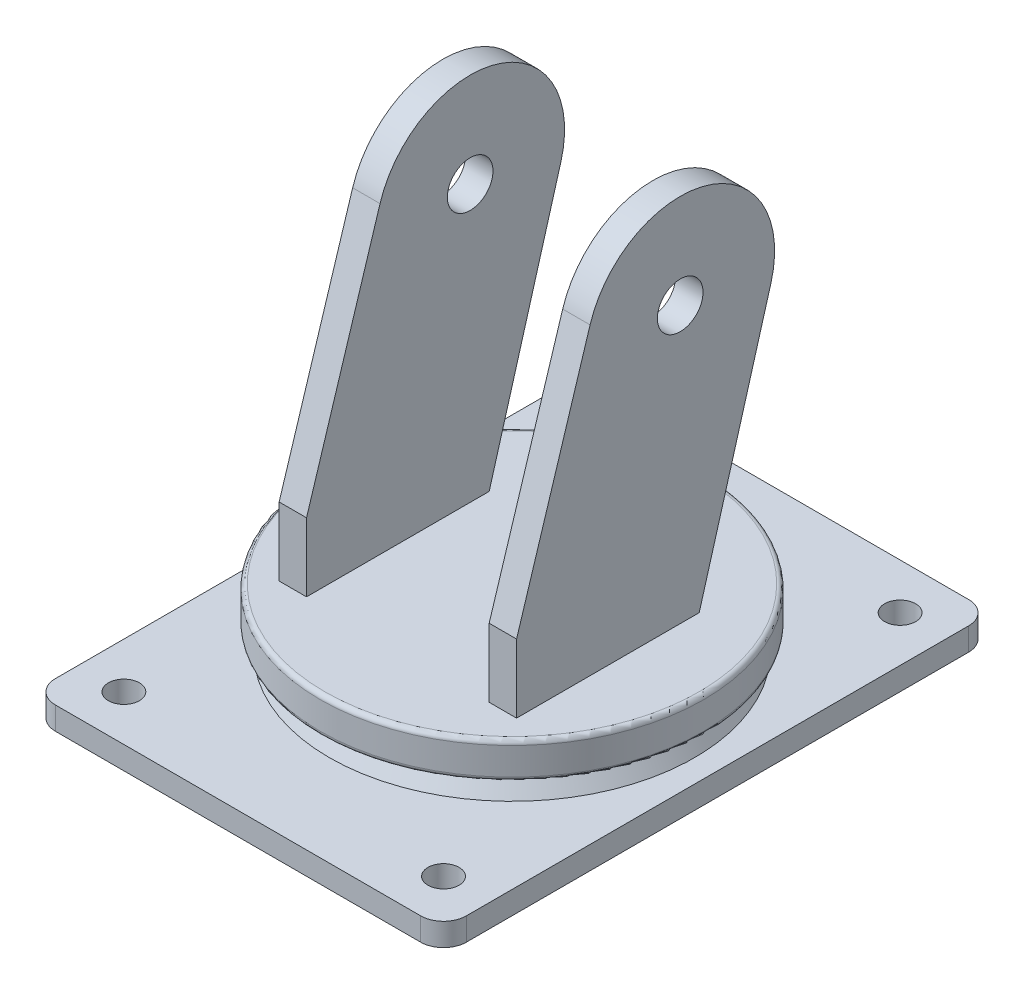
ISO-10303-21;
HEADER;
FILE_DESCRIPTION(('STEP AP214'),'2;1');
FILE_NAME('part.step','',(''),(''),'','','');
FILE_SCHEMA(('AUTOMOTIVE_DESIGN { 1 0 10303 214 1 1 1 1 }'));
ENDSEC;
DATA;
#1=APPLICATION_CONTEXT('core data for automotive mechanical design processes');
#2=APPLICATION_PROTOCOL_DEFINITION('international standard','automotive_design',2000,#1);
#3=PRODUCT_CONTEXT('',#1,'mechanical');
#4=PRODUCT('Part','Part','',(#3));
#5=PRODUCT_RELATED_PRODUCT_CATEGORY('part','',(#4));
#6=PRODUCT_DEFINITION_FORMATION('','',#4);
#7=PRODUCT_DEFINITION_CONTEXT('part definition',#1,'design');
#8=PRODUCT_DEFINITION('design','',#6,#7);
#9=PRODUCT_DEFINITION_SHAPE('','',#8);
#10=(LENGTH_UNIT() NAMED_UNIT(*) SI_UNIT(.MILLI.,.METRE.));
#11=(NAMED_UNIT(*) PLANE_ANGLE_UNIT() SI_UNIT($,.RADIAN.));
#12=(NAMED_UNIT(*) SI_UNIT($,.STERADIAN.) SOLID_ANGLE_UNIT());
#13=UNCERTAINTY_MEASURE_WITH_UNIT(LENGTH_MEASURE(1.E-05),#10,'distance_accuracy_value','');
#14=(GEOMETRIC_REPRESENTATION_CONTEXT(3) GLOBAL_UNCERTAINTY_ASSIGNED_CONTEXT((#13)) GLOBAL_UNIT_ASSIGNED_CONTEXT((#10,
#11,#12)) REPRESENTATION_CONTEXT('',''));
#15=CARTESIAN_POINT('',(0.,0.,0.));
#16=DIRECTION('',(0.,0.,1.));
#17=DIRECTION('',(1.,0.,0.));
#18=AXIS2_PLACEMENT_3D('',#15,#16,#17);
#19=CARTESIAN_POINT('',(45.,5.,-60.));
#20=DIRECTION('',(-1.,0.,0.));
#21=DIRECTION('',(0.,0.,1.));
#22=AXIS2_PLACEMENT_3D('',#19,#20,#21);
#23=PLANE('',#22);
#24=DIRECTION('',(0.,0.,-1.));
#25=VECTOR('',#24,1.);
#26=CARTESIAN_POINT('',(45.,5.,-60.));
#27=LINE('',#26,#25);
#28=CARTESIAN_POINT('',(45.,5.,55.));
#29=VERTEX_POINT('',#28);
#30=CARTESIAN_POINT('',(45.,5.,-55.));
#31=VERTEX_POINT('',#30);
#32=EDGE_CURVE('E265',#29,#31,#27,.T.);
#33=ORIENTED_EDGE('',*,*,#32,.F.);
#34=DIRECTION('',(0.,-1.,0.));
#35=VECTOR('',#34,1.);
#36=CARTESIAN_POINT('',(45.,5.,55.));
#37=LINE('',#36,#35);
#38=CARTESIAN_POINT('',(45.,0.,55.));
#39=VERTEX_POINT('',#38);
#40=EDGE_CURVE('E291',#29,#39,#37,.T.);
#41=ORIENTED_EDGE('',*,*,#40,.T.);
#42=DIRECTION('',(0.,0.,-1.));
#43=VECTOR('',#42,1.);
#44=CARTESIAN_POINT('',(45.,0.,-60.));
#45=LINE('',#44,#43);
#46=CARTESIAN_POINT('',(45.,0.,-55.));
#47=VERTEX_POINT('',#46);
#48=EDGE_CURVE('E279',#39,#47,#45,.T.);
#49=ORIENTED_EDGE('',*,*,#48,.T.);
#50=DIRECTION('',(0.,-1.,0.));
#51=VECTOR('',#50,1.);
#52=CARTESIAN_POINT('',(45.,5.,-55.));
#53=LINE('',#52,#51);
#54=EDGE_CURVE('E278',#47,#31,#53,.F.);
#55=ORIENTED_EDGE('',*,*,#54,.T.);
#56=EDGE_LOOP('',(#33,#41,#49,#55));
#57=FACE_BOUND('',#56,.T.);
#58=ADVANCED_FACE('F47',(#57),#23,.F.);
#59=CARTESIAN_POINT('',(-45.,5.,-60.));
#60=DIRECTION('',(0.,0.,1.));
#61=DIRECTION('',(1.,0.,0.));
#62=AXIS2_PLACEMENT_3D('',#59,#60,#61);
#63=PLANE('',#62);
#64=DIRECTION('',(-1.,0.,0.));
#65=VECTOR('',#64,1.);
#66=CARTESIAN_POINT('',(-45.,0.,-60.));
#67=LINE('',#66,#65);
#68=CARTESIAN_POINT('',(39.9999999999999,0.,-60.));
#69=VERTEX_POINT('',#68);
#70=CARTESIAN_POINT('',(-40.,0.,-60.));
#71=VERTEX_POINT('',#70);
#72=EDGE_CURVE('E282',#69,#71,#67,.T.);
#73=ORIENTED_EDGE('',*,*,#72,.T.);
#74=DIRECTION('',(0.,-1.,0.));
#75=VECTOR('',#74,1.);
#76=CARTESIAN_POINT('',(-40.,5.,-60.));
#77=LINE('',#76,#75);
#78=CARTESIAN_POINT('',(-40.,5.,-60.));
#79=VERTEX_POINT('',#78);
#80=EDGE_CURVE('E323',#71,#79,#77,.F.);
#81=ORIENTED_EDGE('',*,*,#80,.T.);
#82=DIRECTION('',(-1.,0.,0.));
#83=VECTOR('',#82,1.);
#84=CARTESIAN_POINT('',(-45.,5.,-60.));
#85=LINE('',#84,#83);
#86=CARTESIAN_POINT('',(39.9999999999999,5.,-60.));
#87=VERTEX_POINT('',#86);
#88=EDGE_CURVE('E268',#87,#79,#85,.T.);
#89=ORIENTED_EDGE('',*,*,#88,.F.);
#90=DIRECTION('',(0.,-1.,0.));
#91=VECTOR('',#90,1.);
#92=CARTESIAN_POINT('',(40.,5.,-60.));
#93=LINE('',#92,#91);
#94=EDGE_CURVE('E320',#87,#69,#93,.T.);
#95=ORIENTED_EDGE('',*,*,#94,.T.);
#96=EDGE_LOOP('',(#73,#81,#89,#95));
#97=FACE_BOUND('',#96,.T.);
#98=ADVANCED_FACE('F370',(#97),#63,.F.);
#99=CARTESIAN_POINT('',(-45.,5.,-60.));
#100=DIRECTION('',(1.,0.,0.));
#101=DIRECTION('',(0.,0.,-1.));
#102=AXIS2_PLACEMENT_3D('',#99,#100,#101);
#103=PLANE('',#102);
#104=DIRECTION('',(0.,0.,1.));
#105=VECTOR('',#104,1.);
#106=CARTESIAN_POINT('',(-45.,0.,-60.));
#107=LINE('',#106,#105);
#108=CARTESIAN_POINT('',(-45.,0.,-55.));
#109=VERTEX_POINT('',#108);
#110=CARTESIAN_POINT('',(-45.,0.,55.));
#111=VERTEX_POINT('',#110);
#112=EDGE_CURVE('E285',#109,#111,#107,.T.);
#113=ORIENTED_EDGE('',*,*,#112,.T.);
#114=DIRECTION('',(0.,-1.,0.));
#115=VECTOR('',#114,1.);
#116=CARTESIAN_POINT('',(-45.,5.,55.));
#117=LINE('',#116,#115);
#118=CARTESIAN_POINT('',(-45.,5.,55.));
#119=VERTEX_POINT('',#118);
#120=EDGE_CURVE('E318',#111,#119,#117,.F.);
#121=ORIENTED_EDGE('',*,*,#120,.T.);
#122=DIRECTION('',(0.,0.,1.));
#123=VECTOR('',#122,1.);
#124=CARTESIAN_POINT('',(-45.,5.,-60.));
#125=LINE('',#124,#123);
#126=CARTESIAN_POINT('',(-45.,5.,-55.));
#127=VERTEX_POINT('',#126);
#128=EDGE_CURVE('E272',#127,#119,#125,.T.);
#129=ORIENTED_EDGE('',*,*,#128,.F.);
#130=DIRECTION('',(0.,-1.,0.));
#131=VECTOR('',#130,1.);
#132=CARTESIAN_POINT('',(-45.,5.,-55.));
#133=LINE('',#132,#131);
#134=EDGE_CURVE('E315',#127,#109,#133,.T.);
#135=ORIENTED_EDGE('',*,*,#134,.T.);
#136=EDGE_LOOP('',(#113,#121,#129,#135));
#137=FACE_BOUND('',#136,.T.);
#138=ADVANCED_FACE('F376',(#137),#103,.F.);
#139=CARTESIAN_POINT('',(-45.,5.,60.));
#140=DIRECTION('',(0.,0.,-1.));
#141=DIRECTION('',(-1.,0.,0.));
#142=AXIS2_PLACEMENT_3D('',#139,#140,#141);
#143=PLANE('',#142);
#144=DIRECTION('',(1.,0.,0.));
#145=VECTOR('',#144,1.);
#146=CARTESIAN_POINT('',(-45.,0.,60.));
#147=LINE('',#146,#145);
#148=CARTESIAN_POINT('',(-40.,0.,60.));
#149=VERTEX_POINT('',#148);
#150=CARTESIAN_POINT('',(40.,0.,60.));
#151=VERTEX_POINT('',#150);
#152=EDGE_CURVE('E269',#149,#151,#147,.T.);
#153=ORIENTED_EDGE('',*,*,#152,.T.);
#154=DIRECTION('',(0.,-1.,0.));
#155=VECTOR('',#154,1.);
#156=CARTESIAN_POINT('',(40.,5.,60.));
#157=LINE('',#156,#155);
#158=CARTESIAN_POINT('',(40.,5.,60.));
#159=VERTEX_POINT('',#158);
#160=EDGE_CURVE('E305',#151,#159,#157,.F.);
#161=ORIENTED_EDGE('',*,*,#160,.T.);
#162=DIRECTION('',(1.,0.,0.));
#163=VECTOR('',#162,1.);
#164=CARTESIAN_POINT('',(-45.,5.,60.));
#165=LINE('',#164,#163);
#166=CARTESIAN_POINT('',(-40.,5.,60.));
#167=VERTEX_POINT('',#166);
#168=EDGE_CURVE('E275',#167,#159,#165,.T.);
#169=ORIENTED_EDGE('',*,*,#168,.F.);
#170=DIRECTION('',(0.,-1.,0.));
#171=VECTOR('',#170,1.);
#172=CARTESIAN_POINT('',(-40.,5.,60.));
#173=LINE('',#172,#171);
#174=EDGE_CURVE('E302',#167,#149,#173,.T.);
#175=ORIENTED_EDGE('',*,*,#174,.T.);
#176=EDGE_LOOP('',(#153,#161,#169,#175));
#177=FACE_BOUND('',#176,.T.);
#178=ADVANCED_FACE('F460',(#177),#143,.F.);
#179=CARTESIAN_POINT('',(0.,5.,0.));
#180=DIRECTION('',(0.,1.,0.));
#181=DIRECTION('',(0.,0.,1.));
#182=AXIS2_PLACEMENT_3D('',#179,#180,#181);
#183=PLANE('',#182);
#184=CARTESIAN_POINT('',(0.,5.,0.));
#185=DIRECTION('',(0.,1.,0.));
#186=DIRECTION('',(0.,0.,1.));
#187=AXIS2_PLACEMENT_3D('',#184,#185,#186);
#188=CIRCLE('',#187,40.);
#189=CARTESIAN_POINT('',(0.,4.99999999999999,40.));
#190=VERTEX_POINT('',#189);
#191=EDGE_CURVE('E242',#190,#190,#188,.T.);
#192=ORIENTED_EDGE('',*,*,#191,.F.);
#193=EDGE_LOOP('',(#192));
#194=FACE_BOUND('',#193,.T.);
#195=CARTESIAN_POINT('',(35.,5.,50.));
#196=DIRECTION('',(0.,1.,0.));
#197=DIRECTION('',(0.,0.,1.));
#198=AXIS2_PLACEMENT_3D('',#195,#196,#197);
#199=CIRCLE('',#198,3.4);
#200=CARTESIAN_POINT('',(35.,5.,53.4));
#201=VERTEX_POINT('',#200);
#202=EDGE_CURVE('E249',#201,#201,#199,.T.);
#203=ORIENTED_EDGE('',*,*,#202,.F.);
#204=EDGE_LOOP('',(#203));
#205=FACE_BOUND('',#204,.T.);
#206=CARTESIAN_POINT('',(-35.,5.,50.));
#207=DIRECTION('',(0.,1.,0.));
#208=DIRECTION('',(0.,0.,1.));
#209=AXIS2_PLACEMENT_3D('',#206,#207,#208);
#210=CIRCLE('',#209,3.4);
#211=CARTESIAN_POINT('',(-35.,5.,53.4));
#212=VERTEX_POINT('',#211);
#213=EDGE_CURVE('E253',#212,#212,#210,.T.);
#214=ORIENTED_EDGE('',*,*,#213,.F.);
#215=EDGE_LOOP('',(#214));
#216=FACE_BOUND('',#215,.T.);
#217=CARTESIAN_POINT('',(35.,5.,-50.));
#218=DIRECTION('',(0.,1.,0.));
#219=DIRECTION('',(0.,0.,1.));
#220=AXIS2_PLACEMENT_3D('',#217,#218,#219);
#221=CIRCLE('',#220,3.4);
#222=CARTESIAN_POINT('',(35.,5.,-46.6));
#223=VERTEX_POINT('',#222);
#224=EDGE_CURVE('E257',#223,#223,#221,.T.);
#225=ORIENTED_EDGE('',*,*,#224,.F.);
#226=EDGE_LOOP('',(#225));
#227=FACE_BOUND('',#226,.T.);
#228=CARTESIAN_POINT('',(-35.,5.,-50.));
#229=DIRECTION('',(0.,1.,0.));
#230=DIRECTION('',(0.,0.,1.));
#231=AXIS2_PLACEMENT_3D('',#228,#229,#230);
#232=CIRCLE('',#231,3.4);
#233=CARTESIAN_POINT('',(-35.,5.,-46.6));
#234=VERTEX_POINT('',#233);
#235=EDGE_CURVE('E261',#234,#234,#232,.T.);
#236=ORIENTED_EDGE('',*,*,#235,.F.);
#237=EDGE_LOOP('',(#236));
#238=FACE_BOUND('',#237,.T.);
#239=ORIENTED_EDGE('',*,*,#168,.T.);
#240=CARTESIAN_POINT('',(40.,5.,55.));
#241=DIRECTION('',(0.,1.,0.));
#242=DIRECTION('',(0.,0.,1.));
#243=AXIS2_PLACEMENT_3D('',#240,#241,#242);
#244=CIRCLE('',#243,5.);
#245=EDGE_CURVE('E313',#159,#29,#244,.T.);
#246=ORIENTED_EDGE('',*,*,#245,.T.);
#247=ORIENTED_EDGE('',*,*,#32,.T.);
#248=CARTESIAN_POINT('',(40.,5.,-55.));
#249=DIRECTION('',(0.,1.,0.));
#250=DIRECTION('',(0.,0.,1.));
#251=AXIS2_PLACEMENT_3D('',#248,#249,#250);
#252=CIRCLE('',#251,5.);
#253=EDGE_CURVE('E307',#31,#87,#252,.T.);
#254=ORIENTED_EDGE('',*,*,#253,.T.);
#255=ORIENTED_EDGE('',*,*,#88,.T.);
#256=CARTESIAN_POINT('',(-40.,5.,-55.));
#257=DIRECTION('',(0.,1.,0.));
#258=DIRECTION('',(0.,0.,1.));
#259=AXIS2_PLACEMENT_3D('',#256,#257,#258);
#260=CIRCLE('',#259,5.);
#261=EDGE_CURVE('E309',#79,#127,#260,.T.);
#262=ORIENTED_EDGE('',*,*,#261,.T.);
#263=ORIENTED_EDGE('',*,*,#128,.T.);
#264=CARTESIAN_POINT('',(-40.,5.,55.));
#265=DIRECTION('',(0.,1.,0.));
#266=DIRECTION('',(0.,0.,1.));
#267=AXIS2_PLACEMENT_3D('',#264,#265,#266);
#268=CIRCLE('',#267,5.);
#269=EDGE_CURVE('E311',#119,#167,#268,.T.);
#270=ORIENTED_EDGE('',*,*,#269,.T.);
#271=EDGE_LOOP('',(#239,#246,#247,#254,#255,#262,#263,#270));
#272=FACE_BOUND('',#271,.T.);
#273=ADVANCED_FACE('F457',(#194,#205,#216,#227,#238,#272),#183,.T.);
#274=CARTESIAN_POINT('',(0.,0.,0.));
#275=DIRECTION('',(0.,1.,0.));
#276=DIRECTION('',(0.,0.,1.));
#277=AXIS2_PLACEMENT_3D('',#274,#275,#276);
#278=PLANE('',#277);
#279=CARTESIAN_POINT('',(0.,0.,0.));
#280=DIRECTION('',(0.,1.,0.));
#281=DIRECTION('',(0.,0.,1.));
#282=AXIS2_PLACEMENT_3D('',#279,#280,#281);
#283=CIRCLE('',#282,18.);
#284=CARTESIAN_POINT('',(0.,0.,18.));
#285=VERTEX_POINT('',#284);
#286=EDGE_CURVE('E336',#285,#285,#283,.T.);
#287=ORIENTED_EDGE('',*,*,#286,.T.);
#288=EDGE_LOOP('',(#287));
#289=FACE_BOUND('',#288,.T.);
#290=CARTESIAN_POINT('',(35.,0.,50.));
#291=DIRECTION('',(0.,1.,0.));
#292=DIRECTION('',(0.,0.,1.));
#293=AXIS2_PLACEMENT_3D('',#290,#291,#292);
#294=CIRCLE('',#293,3.4);
#295=CARTESIAN_POINT('',(35.,0.,53.4));
#296=VERTEX_POINT('',#295);
#297=EDGE_CURVE('E252',#296,#296,#294,.T.);
#298=ORIENTED_EDGE('',*,*,#297,.T.);
#299=EDGE_LOOP('',(#298));
#300=FACE_BOUND('',#299,.T.);
#301=CARTESIAN_POINT('',(-35.,0.,50.));
#302=DIRECTION('',(0.,1.,0.));
#303=DIRECTION('',(0.,0.,1.));
#304=AXIS2_PLACEMENT_3D('',#301,#302,#303);
#305=CIRCLE('',#304,3.4);
#306=CARTESIAN_POINT('',(-35.,0.,53.4));
#307=VERTEX_POINT('',#306);
#308=EDGE_CURVE('E256',#307,#307,#305,.T.);
#309=ORIENTED_EDGE('',*,*,#308,.T.);
#310=EDGE_LOOP('',(#309));
#311=FACE_BOUND('',#310,.T.);
#312=CARTESIAN_POINT('',(35.,0.,-50.));
#313=DIRECTION('',(0.,1.,0.));
#314=DIRECTION('',(0.,0.,1.));
#315=AXIS2_PLACEMENT_3D('',#312,#313,#314);
#316=CIRCLE('',#315,3.4);
#317=CARTESIAN_POINT('',(35.,0.,-46.6));
#318=VERTEX_POINT('',#317);
#319=EDGE_CURVE('E260',#318,#318,#316,.T.);
#320=ORIENTED_EDGE('',*,*,#319,.T.);
#321=EDGE_LOOP('',(#320));
#322=FACE_BOUND('',#321,.T.);
#323=CARTESIAN_POINT('',(-35.,0.,-50.));
#324=DIRECTION('',(0.,1.,0.));
#325=DIRECTION('',(0.,0.,1.));
#326=AXIS2_PLACEMENT_3D('',#323,#324,#325);
#327=CIRCLE('',#326,3.4);
#328=CARTESIAN_POINT('',(-35.,0.,-46.6));
#329=VERTEX_POINT('',#328);
#330=EDGE_CURVE('E264',#329,#329,#327,.T.);
#331=ORIENTED_EDGE('',*,*,#330,.T.);
#332=EDGE_LOOP('',(#331));
#333=FACE_BOUND('',#332,.T.);
#334=ORIENTED_EDGE('',*,*,#48,.F.);
#335=CARTESIAN_POINT('',(40.,0.,55.));
#336=DIRECTION('',(0.,1.,0.));
#337=DIRECTION('',(0.,0.,1.));
#338=AXIS2_PLACEMENT_3D('',#335,#336,#337);
#339=CIRCLE('',#338,5.);
#340=EDGE_CURVE('E300',#39,#151,#339,.F.);
#341=ORIENTED_EDGE('',*,*,#340,.T.);
#342=ORIENTED_EDGE('',*,*,#152,.F.);
#343=CARTESIAN_POINT('',(-40.,0.,55.));
#344=DIRECTION('',(0.,1.,0.));
#345=DIRECTION('',(0.,0.,1.));
#346=AXIS2_PLACEMENT_3D('',#343,#344,#345);
#347=CIRCLE('',#346,5.);
#348=EDGE_CURVE('E298',#149,#111,#347,.F.);
#349=ORIENTED_EDGE('',*,*,#348,.T.);
#350=ORIENTED_EDGE('',*,*,#112,.F.);
#351=CARTESIAN_POINT('',(-40.,0.,-55.));
#352=DIRECTION('',(0.,1.,0.));
#353=DIRECTION('',(0.,0.,1.));
#354=AXIS2_PLACEMENT_3D('',#351,#352,#353);
#355=CIRCLE('',#354,5.);
#356=EDGE_CURVE('E296',#109,#71,#355,.F.);
#357=ORIENTED_EDGE('',*,*,#356,.T.);
#358=ORIENTED_EDGE('',*,*,#72,.F.);
#359=CARTESIAN_POINT('',(40.,0.,-55.));
#360=DIRECTION('',(0.,1.,0.));
#361=DIRECTION('',(0.,0.,1.));
#362=AXIS2_PLACEMENT_3D('',#359,#360,#361);
#363=CIRCLE('',#362,5.);
#364=EDGE_CURVE('E294',#69,#47,#363,.F.);
#365=ORIENTED_EDGE('',*,*,#364,.T.);
#366=EDGE_LOOP('',(#334,#341,#342,#349,#350,#357,#358,#365));
#367=FACE_BOUND('',#366,.T.);
#368=ADVANCED_FACE('F386',(#289,#300,#311,#322,#333,#367),#278,.F.);
#369=CARTESIAN_POINT('',(40.,5.,55.));
#370=DIRECTION('',(0.,-1.,0.));
#371=DIRECTION('',(0.,0.,-1.));
#372=AXIS2_PLACEMENT_3D('',#369,#370,#371);
#373=CYLINDRICAL_SURFACE('',#372,5.);
#374=ORIENTED_EDGE('',*,*,#245,.F.);
#375=ORIENTED_EDGE('',*,*,#160,.F.);
#376=ORIENTED_EDGE('',*,*,#340,.F.);
#377=ORIENTED_EDGE('',*,*,#40,.F.);
#378=EDGE_LOOP('',(#374,#375,#376,#377));
#379=FACE_BOUND('',#378,.T.);
#380=ADVANCED_FACE('F382',(#379),#373,.T.);
#381=CARTESIAN_POINT('',(-40.,5.,55.));
#382=DIRECTION('',(0.,-1.,0.));
#383=DIRECTION('',(0.,0.,-1.));
#384=AXIS2_PLACEMENT_3D('',#381,#382,#383);
#385=CYLINDRICAL_SURFACE('',#384,5.);
#386=ORIENTED_EDGE('',*,*,#269,.F.);
#387=ORIENTED_EDGE('',*,*,#120,.F.);
#388=ORIENTED_EDGE('',*,*,#348,.F.);
#389=ORIENTED_EDGE('',*,*,#174,.F.);
#390=EDGE_LOOP('',(#386,#387,#388,#389));
#391=FACE_BOUND('',#390,.T.);
#392=ADVANCED_FACE('F385',(#391),#385,.T.);
#393=CARTESIAN_POINT('',(-40.,5.,-55.));
#394=DIRECTION('',(0.,-1.,0.));
#395=DIRECTION('',(0.,0.,-1.));
#396=AXIS2_PLACEMENT_3D('',#393,#394,#395);
#397=CYLINDRICAL_SURFACE('',#396,5.);
#398=ORIENTED_EDGE('',*,*,#261,.F.);
#399=ORIENTED_EDGE('',*,*,#80,.F.);
#400=ORIENTED_EDGE('',*,*,#356,.F.);
#401=ORIENTED_EDGE('',*,*,#134,.F.);
#402=EDGE_LOOP('',(#398,#399,#400,#401));
#403=FACE_BOUND('',#402,.T.);
#404=ADVANCED_FACE('F390',(#403),#397,.T.);
#405=CARTESIAN_POINT('',(40.,5.,-55.));
#406=DIRECTION('',(0.,-1.,0.));
#407=DIRECTION('',(0.,0.,-1.));
#408=AXIS2_PLACEMENT_3D('',#405,#406,#407);
#409=CYLINDRICAL_SURFACE('',#408,5.);
#410=ORIENTED_EDGE('',*,*,#253,.F.);
#411=ORIENTED_EDGE('',*,*,#54,.F.);
#412=ORIENTED_EDGE('',*,*,#364,.F.);
#413=ORIENTED_EDGE('',*,*,#94,.F.);
#414=EDGE_LOOP('',(#410,#411,#412,#413));
#415=FACE_BOUND('',#414,.T.);
#416=ADVANCED_FACE('F394',(#415),#409,.T.);
#417=CARTESIAN_POINT('',(-35.,5.,-50.));
#418=DIRECTION('',(0.,1.,0.));
#419=DIRECTION('',(0.,0.,1.));
#420=AXIS2_PLACEMENT_3D('',#417,#418,#419);
#421=CYLINDRICAL_SURFACE('',#420,3.4);
#422=ORIENTED_EDGE('',*,*,#235,.T.);
#423=EDGE_LOOP('',(#422));
#424=FACE_BOUND('',#423,.T.);
#425=ORIENTED_EDGE('',*,*,#330,.F.);
#426=EDGE_LOOP('',(#425));
#427=FACE_BOUND('',#426,.T.);
#428=ADVANCED_FACE('F398',(#424,#427),#421,.F.);
#429=CARTESIAN_POINT('',(35.,5.,-50.));
#430=DIRECTION('',(0.,1.,0.));
#431=DIRECTION('',(0.,0.,1.));
#432=AXIS2_PLACEMENT_3D('',#429,#430,#431);
#433=CYLINDRICAL_SURFACE('',#432,3.4);
#434=ORIENTED_EDGE('',*,*,#224,.T.);
#435=EDGE_LOOP('',(#434));
#436=FACE_BOUND('',#435,.T.);
#437=ORIENTED_EDGE('',*,*,#319,.F.);
#438=EDGE_LOOP('',(#437));
#439=FACE_BOUND('',#438,.T.);
#440=ADVANCED_FACE('F449',(#436,#439),#433,.F.);
#441=CARTESIAN_POINT('',(-35.,5.,50.));
#442=DIRECTION('',(0.,1.,0.));
#443=DIRECTION('',(0.,0.,1.));
#444=AXIS2_PLACEMENT_3D('',#441,#442,#443);
#445=CYLINDRICAL_SURFACE('',#444,3.4);
#446=ORIENTED_EDGE('',*,*,#213,.T.);
#447=EDGE_LOOP('',(#446));
#448=FACE_BOUND('',#447,.T.);
#449=ORIENTED_EDGE('',*,*,#308,.F.);
#450=EDGE_LOOP('',(#449));
#451=FACE_BOUND('',#450,.T.);
#452=ADVANCED_FACE('F445',(#448,#451),#445,.F.);
#453=CARTESIAN_POINT('',(35.,5.,50.));
#454=DIRECTION('',(0.,1.,0.));
#455=DIRECTION('',(0.,0.,1.));
#456=AXIS2_PLACEMENT_3D('',#453,#454,#455);
#457=CYLINDRICAL_SURFACE('',#456,3.4);
#458=ORIENTED_EDGE('',*,*,#202,.T.);
#459=EDGE_LOOP('',(#458));
#460=FACE_BOUND('',#459,.T.);
#461=ORIENTED_EDGE('',*,*,#297,.F.);
#462=EDGE_LOOP('',(#461));
#463=FACE_BOUND('',#462,.T.);
#464=ADVANCED_FACE('F441',(#460,#463),#457,.F.);
#465=CARTESIAN_POINT('',(0.,2.,0.));
#466=DIRECTION('',(0.,-1.,0.));
#467=DIRECTION('',(0.,0.,-1.));
#468=AXIS2_PLACEMENT_3D('',#465,#466,#467);
#469=CYLINDRICAL_SURFACE('',#468,17.5);
#470=CARTESIAN_POINT('',(0.,1.5,0.));
#471=DIRECTION('',(0.,-1.,0.));
#472=DIRECTION('',(0.,0.,-1.));
#473=AXIS2_PLACEMENT_3D('',#470,#471,#472);
#474=CIRCLE('',#473,17.5);
#475=CARTESIAN_POINT('',(0.,1.5,-17.5));
#476=VERTEX_POINT('',#475);
#477=EDGE_CURVE('E246',#476,#476,#474,.F.);
#478=ORIENTED_EDGE('',*,*,#477,.T.);
#479=EDGE_LOOP('',(#478));
#480=FACE_BOUND('',#479,.T.);
#481=CARTESIAN_POINT('',(0.,0.5,0.));
#482=DIRECTION('',(0.,1.,0.));
#483=DIRECTION('',(0.,0.,1.));
#484=AXIS2_PLACEMENT_3D('',#481,#482,#483);
#485=CIRCLE('',#484,17.5);
#486=CARTESIAN_POINT('',(0.,0.5,17.5));
#487=VERTEX_POINT('',#486);
#488=EDGE_CURVE('E325',#487,#487,#485,.F.);
#489=ORIENTED_EDGE('',*,*,#488,.T.);
#490=EDGE_LOOP('',(#489));
#491=FACE_BOUND('',#490,.T.);
#492=ADVANCED_FACE('F427',(#480,#491),#469,.F.);
#493=CARTESIAN_POINT('',(0.,2.,0.));
#494=DIRECTION('',(0.,-1.,0.));
#495=DIRECTION('',(0.,0.,-1.));
#496=AXIS2_PLACEMENT_3D('',#493,#494,#495);
#497=PLANE('',#496);
#498=CARTESIAN_POINT('',(0.,2.,0.));
#499=DIRECTION('',(0.,-1.,0.));
#500=DIRECTION('',(0.,0.,-1.));
#501=AXIS2_PLACEMENT_3D('',#498,#499,#500);
#502=CIRCLE('',#501,17.);
#503=CARTESIAN_POINT('',(0.,2.,-17.));
#504=VERTEX_POINT('',#503);
#505=EDGE_CURVE('E342',#504,#504,#502,.T.);
#506=ORIENTED_EDGE('',*,*,#505,.T.);
#507=EDGE_LOOP('',(#506));
#508=FACE_BOUND('',#507,.T.);
#509=CARTESIAN_POINT('',(0.,2.,0.));
#510=DIRECTION('',(0.,-1.,0.));
#511=DIRECTION('',(0.,0.,-1.));
#512=AXIS2_PLACEMENT_3D('',#509,#510,#511);
#513=CIRCLE('',#512,16.5);
#514=CARTESIAN_POINT('',(0.,2.,-16.5));
#515=VERTEX_POINT('',#514);
#516=EDGE_CURVE('E241',#515,#515,#513,.T.);
#517=ORIENTED_EDGE('',*,*,#516,.F.);
#518=EDGE_LOOP('',(#517));
#519=FACE_BOUND('',#518,.T.);
#520=ADVANCED_FACE('F404',(#508,#519),#497,.T.);
#521=CARTESIAN_POINT('',(0.,0.5,0.));
#522=DIRECTION('',(0.,1.,0.));
#523=DIRECTION('',(0.,0.,1.));
#524=AXIS2_PLACEMENT_3D('',#521,#522,#523);
#525=TOROIDAL_SURFACE('',#524,18.,0.5);
#526=ORIENTED_EDGE('',*,*,#286,.F.);
#527=EDGE_LOOP('',(#526));
#528=FACE_BOUND('',#527,.T.);
#529=ORIENTED_EDGE('',*,*,#488,.F.);
#530=EDGE_LOOP('',(#529));
#531=FACE_BOUND('',#530,.T.);
#532=ADVANCED_FACE('F400',(#528,#531),#525,.T.);
#533=CARTESIAN_POINT('',(0.,0.,0.));
#534=DIRECTION('',(0.,-1.,0.));
#535=DIRECTION('',(0.,0.,-1.));
#536=AXIS2_PLACEMENT_3D('',#533,#534,#535);
#537=PLANE('',#536);
#538=CARTESIAN_POINT('',(0.,0.,0.));
#539=DIRECTION('',(0.,-1.,0.));
#540=DIRECTION('',(0.,0.,-1.));
#541=AXIS2_PLACEMENT_3D('',#538,#539,#540);
#542=CIRCLE('',#541,14.5);
#543=CARTESIAN_POINT('',(0.,0.,-14.5));
#544=VERTEX_POINT('',#543);
#545=EDGE_CURVE('E339',#544,#544,#542,.T.);
#546=ORIENTED_EDGE('',*,*,#545,.T.);
#547=EDGE_LOOP('',(#546));
#548=FACE_BOUND('',#547,.T.);
#549=ADVANCED_FACE('F403',(#548),#537,.T.);
#550=CARTESIAN_POINT('',(0.,2.,0.));
#551=DIRECTION('',(0.,-1.,0.));
#552=DIRECTION('',(0.,0.,-1.));
#553=AXIS2_PLACEMENT_3D('',#550,#551,#552);
#554=TOROIDAL_SURFACE('',#553,14.5,2.);
#555=ORIENTED_EDGE('',*,*,#516,.T.);
#556=EDGE_LOOP('',(#555));
#557=FACE_BOUND('',#556,.T.);
#558=ORIENTED_EDGE('',*,*,#545,.F.);
#559=EDGE_LOOP('',(#558));
#560=FACE_BOUND('',#559,.T.);
#561=ADVANCED_FACE('F406',(#557,#560),#554,.T.);
#562=CARTESIAN_POINT('',(0.,1.5,0.));
#563=DIRECTION('',(0.,-1.,0.));
#564=DIRECTION('',(0.,0.,-1.));
#565=AXIS2_PLACEMENT_3D('',#562,#563,#564);
#566=TOROIDAL_SURFACE('',#565,17.,0.5);
#567=ORIENTED_EDGE('',*,*,#477,.F.);
#568=EDGE_LOOP('',(#567));
#569=FACE_BOUND('',#568,.T.);
#570=ORIENTED_EDGE('',*,*,#505,.F.);
#571=EDGE_LOOP('',(#570));
#572=FACE_BOUND('',#571,.T.);
#573=ADVANCED_FACE('F409',(#569,#572),#566,.F.);
#574=CARTESIAN_POINT('',(0.,10.,0.));
#575=DIRECTION('',(0.,-1.,0.));
#576=DIRECTION('',(0.,0.,-1.));
#577=AXIS2_PLACEMENT_3D('',#574,#575,#576);
#578=CONICAL_SURFACE('',#577,37.,0.540419500270584);
#579=ORIENTED_EDGE('',*,*,#191,.T.);
#580=EDGE_LOOP('',(#579));
#581=FACE_BOUND('',#580,.T.);
#582=CARTESIAN_POINT('',(0.,10.,0.));
#583=DIRECTION('',(0.,1.,0.));
#584=DIRECTION('',(0.,0.,1.));
#585=AXIS2_PLACEMENT_3D('',#582,#583,#584);
#586=CIRCLE('',#585,37.);
#587=CARTESIAN_POINT('',(0.,10.,37.));
#588=VERTEX_POINT('',#587);
#589=EDGE_CURVE('E238',#588,#588,#586,.T.);
#590=ORIENTED_EDGE('',*,*,#589,.F.);
#591=EDGE_LOOP('',(#590));
#592=FACE_BOUND('',#591,.T.);
#593=ADVANCED_FACE('F412',(#581,#592),#578,.T.);
#594=CARTESIAN_POINT('',(0.,18.,0.));
#595=DIRECTION('',(0.,-1.,0.));
#596=DIRECTION('',(0.,0.,-1.));
#597=AXIS2_PLACEMENT_3D('',#594,#595,#596);
#598=CYLINDRICAL_SURFACE('',#597,42.);
#599=CARTESIAN_POINT('',(0.,17.,0.));
#600=DIRECTION('',(0.,1.,0.));
#601=DIRECTION('',(0.,0.,1.));
#602=AXIS2_PLACEMENT_3D('',#599,#600,#601);
#603=CIRCLE('',#602,42.);
#604=CARTESIAN_POINT('',(0.,17.,42.));
#605=VERTEX_POINT('',#604);
#606=EDGE_CURVE('E11',#605,#605,#603,.F.);
#607=ORIENTED_EDGE('',*,*,#606,.T.);
#608=EDGE_LOOP('',(#607));
#609=FACE_BOUND('',#608,.T.);
#610=CARTESIAN_POINT('',(0.,11.,0.));
#611=DIRECTION('',(0.,1.,0.));
#612=DIRECTION('',(0.,0.,1.));
#613=AXIS2_PLACEMENT_3D('',#610,#611,#612);
#614=CIRCLE('',#613,42.);
#615=CARTESIAN_POINT('',(0.,11.,42.));
#616=VERTEX_POINT('',#615);
#617=EDGE_CURVE('E245',#616,#616,#614,.T.);
#618=ORIENTED_EDGE('',*,*,#617,.T.);
#619=EDGE_LOOP('',(#618));
#620=FACE_BOUND('',#619,.T.);
#621=ADVANCED_FACE('F419',(#609,#620),#598,.T.);
#622=CARTESIAN_POINT('',(0.,18.,0.));
#623=DIRECTION('',(0.,1.,0.));
#624=DIRECTION('',(0.,0.,1.));
#625=AXIS2_PLACEMENT_3D('',#622,#623,#624);
#626=PLANE('',#625);
#627=CARTESIAN_POINT('',(0.,18.,0.));
#628=DIRECTION('',(0.,1.,0.));
#629=DIRECTION('',(0.,0.,1.));
#630=AXIS2_PLACEMENT_3D('',#627,#628,#629);
#631=CIRCLE('',#630,41.);
#632=CARTESIAN_POINT('',(0.,18.,41.));
#633=VERTEX_POINT('',#632);
#634=EDGE_CURVE('E55',#633,#633,#631,.T.);
#635=ORIENTED_EDGE('',*,*,#634,.T.);
#636=EDGE_LOOP('',(#635));
#637=FACE_BOUND('',#636,.T.);
#638=DIRECTION('',(0.,0.,-1.));
#639=VECTOR('',#638,1.);
#640=CARTESIAN_POINT('',(-26.,18.,0.));
#641=LINE('',#640,#639);
#642=CARTESIAN_POINT('',(-26.,18.,25.));
#643=VERTEX_POINT('',#642);
#644=CARTESIAN_POINT('',(-26.,18.,-15.));
#645=VERTEX_POINT('',#644);
#646=EDGE_CURVE('E175',#643,#645,#641,.T.);
#647=ORIENTED_EDGE('',*,*,#646,.T.);
#648=DIRECTION('',(1.,0.,0.));
#649=VECTOR('',#648,1.);
#650=CARTESIAN_POINT('',(-26.,18.,-15.));
#651=LINE('',#650,#649);
#652=CARTESIAN_POINT('',(-20.,18.,-15.));
#653=VERTEX_POINT('',#652);
#654=EDGE_CURVE('E819',#645,#653,#651,.T.);
#655=ORIENTED_EDGE('',*,*,#654,.T.);
#656=DIRECTION('',(0.,0.,-1.));
#657=VECTOR('',#656,1.);
#658=CARTESIAN_POINT('',(-20.,18.,0.));
#659=LINE('',#658,#657);
#660=CARTESIAN_POINT('',(-20.,18.,25.));
#661=VERTEX_POINT('',#660);
#662=EDGE_CURVE('E187',#661,#653,#659,.T.);
#663=ORIENTED_EDGE('',*,*,#662,.F.);
#664=DIRECTION('',(1.,0.,0.));
#665=VECTOR('',#664,1.);
#666=CARTESIAN_POINT('',(-26.,18.,25.));
#667=LINE('',#666,#665);
#668=EDGE_CURVE('E191',#643,#661,#667,.T.);
#669=ORIENTED_EDGE('',*,*,#668,.F.);
#670=EDGE_LOOP('',(#647,#655,#663,#669));
#671=FACE_BOUND('',#670,.T.);
#672=DIRECTION('',(0.,0.,-1.));
#673=VECTOR('',#672,1.);
#674=CARTESIAN_POINT('',(26.,18.,0.));
#675=LINE('',#674,#673);
#676=CARTESIAN_POINT('',(26.,18.,25.));
#677=VERTEX_POINT('',#676);
#678=CARTESIAN_POINT('',(26.,18.,-15.));
#679=VERTEX_POINT('',#678);
#680=EDGE_CURVE('E206',#677,#679,#675,.T.);
#681=ORIENTED_EDGE('',*,*,#680,.F.);
#682=DIRECTION('',(-1.,0.,0.));
#683=VECTOR('',#682,1.);
#684=CARTESIAN_POINT('',(26.,18.,25.));
#685=LINE('',#684,#683);
#686=CARTESIAN_POINT('',(20.,18.,25.));
#687=VERTEX_POINT('',#686);
#688=EDGE_CURVE('E216',#677,#687,#685,.T.);
#689=ORIENTED_EDGE('',*,*,#688,.T.);
#690=DIRECTION('',(0.,0.,-1.));
#691=VECTOR('',#690,1.);
#692=CARTESIAN_POINT('',(20.,18.,0.));
#693=LINE('',#692,#691);
#694=CARTESIAN_POINT('',(20.,18.,-15.));
#695=VERTEX_POINT('',#694);
#696=EDGE_CURVE('E198',#687,#695,#693,.T.);
#697=ORIENTED_EDGE('',*,*,#696,.T.);
#698=DIRECTION('',(-1.,0.,0.));
#699=VECTOR('',#698,1.);
#700=CARTESIAN_POINT('',(26.,18.,-15.));
#701=LINE('',#700,#699);
#702=EDGE_CURVE('E236',#679,#695,#701,.T.);
#703=ORIENTED_EDGE('',*,*,#702,.F.);
#704=EDGE_LOOP('',(#681,#689,#697,#703));
#705=FACE_BOUND('',#704,.T.);
#706=ADVANCED_FACE('F196',(#637,#671,#705),#626,.T.);
#707=CARTESIAN_POINT('',(0.,10.,0.));
#708=DIRECTION('',(0.,1.,0.));
#709=DIRECTION('',(0.,0.,1.));
#710=AXIS2_PLACEMENT_3D('',#707,#708,#709);
#711=PLANE('',#710);
#712=CARTESIAN_POINT('',(0.,10.,0.));
#713=DIRECTION('',(0.,1.,0.));
#714=DIRECTION('',(0.,0.,1.));
#715=AXIS2_PLACEMENT_3D('',#712,#713,#714);
#716=CIRCLE('',#715,41.);
#717=CARTESIAN_POINT('',(0.,10.,41.));
#718=VERTEX_POINT('',#717);
#719=EDGE_CURVE('E354',#718,#718,#716,.F.);
#720=ORIENTED_EDGE('',*,*,#719,.T.);
#721=EDGE_LOOP('',(#720));
#722=FACE_BOUND('',#721,.T.);
#723=ORIENTED_EDGE('',*,*,#589,.T.);
#724=EDGE_LOOP('',(#723));
#725=FACE_BOUND('',#724,.T.);
#726=ADVANCED_FACE('F538',(#722,#725),#711,.F.);
#727=CARTESIAN_POINT('',(26.,18.,-15.));
#728=DIRECTION('',(0.,0.276265326713221,0.961081406154566));
#729=DIRECTION('',(0.,-0.961081406154566,0.276265326713221));
#730=AXIS2_PLACEMENT_3D('',#727,#728,#729);
#731=PLANE('',#730);
#732=DIRECTION('',(0.,0.961081406154565,-0.276265326713221));
#733=VECTOR('',#732,1.);
#734=CARTESIAN_POINT('',(20.,18.,-15.));
#735=LINE('',#734,#733);
#736=CARTESIAN_POINT('',(20.,72.659714104669,-30.7120756665113));
#737=VERTEX_POINT('',#736);
#738=EDGE_CURVE('E70',#695,#737,#735,.T.);
#739=ORIENTED_EDGE('',*,*,#738,.T.);
#740=DIRECTION('',(-1.,0.,0.));
#741=VECTOR('',#740,1.);
#742=CARTESIAN_POINT('',(26.,72.659714104669,-30.7120756665113));
#743=LINE('',#742,#741);
#744=CARTESIAN_POINT('',(26.,72.659714104669,-30.7120756665113));
#745=VERTEX_POINT('',#744);
#746=EDGE_CURVE('E233',#745,#737,#743,.T.);
#747=ORIENTED_EDGE('',*,*,#746,.F.);
#748=DIRECTION('',(0.,0.961081406154565,-0.276265326713221));
#749=VECTOR('',#748,1.);
#750=CARTESIAN_POINT('',(26.,18.,-15.));
#751=LINE('',#750,#749);
#752=EDGE_CURVE('E208',#679,#745,#751,.T.);
#753=ORIENTED_EDGE('',*,*,#752,.F.);
#754=ORIENTED_EDGE('',*,*,#702,.T.);
#755=EDGE_LOOP('',(#739,#747,#753,#754));
#756=FACE_BOUND('',#755,.T.);
#757=ADVANCED_FACE('F543',(#756),#731,.F.);
#758=CARTESIAN_POINT('',(26.,78.3726739036012,-10.8376328539252));
#759=DIRECTION('',(-1.,0.,0.));
#760=DIRECTION('',(0.,0.,1.));
#761=AXIS2_PLACEMENT_3D('',#758,#759,#760);
#762=CYLINDRICAL_SURFACE('',#761,20.6792501502103);
#763=CARTESIAN_POINT('',(20.,78.3726739036012,-10.8376328539252));
#764=DIRECTION('',(1.,0.,0.));
#765=DIRECTION('',(0.,0.,-1.));
#766=AXIS2_PLACEMENT_3D('',#763,#764,#765);
#767=CIRCLE('',#766,20.6792501502103);
#768=CARTESIAN_POINT('',(20.,84.5384078960306,8.90103759546352));
#769=VERTEX_POINT('',#768);
#770=EDGE_CURVE('E219',#737,#769,#767,.T.);
#771=ORIENTED_EDGE('',*,*,#770,.T.);
#772=DIRECTION('',(-1.,0.,0.));
#773=VECTOR('',#772,1.);
#774=CARTESIAN_POINT('',(26.,84.5384078960306,8.90103759546352));
#775=LINE('',#774,#773);
#776=CARTESIAN_POINT('',(26.,84.5384078960306,8.90103759546352));
#777=VERTEX_POINT('',#776);
#778=EDGE_CURVE('E230',#777,#769,#775,.T.);
#779=ORIENTED_EDGE('',*,*,#778,.F.);
#780=CARTESIAN_POINT('',(26.,78.3726739036012,-10.8376328539252));
#781=DIRECTION('',(1.,0.,0.));
#782=DIRECTION('',(0.,0.,-1.));
#783=AXIS2_PLACEMENT_3D('',#780,#781,#782);
#784=CIRCLE('',#783,20.6792501502103);
#785=EDGE_CURVE('E211',#745,#777,#784,.T.);
#786=ORIENTED_EDGE('',*,*,#785,.F.);
#787=ORIENTED_EDGE('',*,*,#746,.T.);
#788=EDGE_LOOP('',(#771,#779,#786,#787));
#789=FACE_BOUND('',#788,.T.);
#790=ADVANCED_FACE('F546',(#789),#762,.T.);
#791=CARTESIAN_POINT('',(26.,33.,25.));
#792=DIRECTION('',(0.,-0.29816042398262,-0.954515773348196));
#793=DIRECTION('',(0.,0.954515773348196,-0.29816042398262));
#794=AXIS2_PLACEMENT_3D('',#791,#792,#793);
#795=PLANE('',#794);
#796=DIRECTION('',(0.,-0.954515773348196,0.29816042398262));
#797=VECTOR('',#796,1.);
#798=CARTESIAN_POINT('',(20.,33.,25.));
#799=LINE('',#798,#797);
#800=CARTESIAN_POINT('',(20.,33.,25.));
#801=VERTEX_POINT('',#800);
#802=EDGE_CURVE('E221',#769,#801,#799,.T.);
#803=ORIENTED_EDGE('',*,*,#802,.T.);
#804=DIRECTION('',(-1.,0.,0.));
#805=VECTOR('',#804,1.);
#806=CARTESIAN_POINT('',(26.,33.,25.));
#807=LINE('',#806,#805);
#808=CARTESIAN_POINT('',(26.,33.,25.));
#809=VERTEX_POINT('',#808);
#810=EDGE_CURVE('E227',#809,#801,#807,.T.);
#811=ORIENTED_EDGE('',*,*,#810,.F.);
#812=DIRECTION('',(0.,-0.954515773348196,0.29816042398262));
#813=VECTOR('',#812,1.);
#814=CARTESIAN_POINT('',(26.,33.,25.));
#815=LINE('',#814,#813);
#816=EDGE_CURVE('E213',#777,#809,#815,.T.);
#817=ORIENTED_EDGE('',*,*,#816,.F.);
#818=ORIENTED_EDGE('',*,*,#778,.T.);
#819=EDGE_LOOP('',(#803,#811,#817,#818));
#820=FACE_BOUND('',#819,.T.);
#821=ADVANCED_FACE('F554',(#820),#795,.F.);
#822=CARTESIAN_POINT('',(26.,18.,25.));
#823=DIRECTION('',(0.,0.,-1.));
#824=DIRECTION('',(-1.,0.,0.));
#825=AXIS2_PLACEMENT_3D('',#822,#823,#824);
#826=PLANE('',#825);
#827=DIRECTION('',(0.,-1.,0.));
#828=VECTOR('',#827,1.);
#829=CARTESIAN_POINT('',(20.,18.,25.));
#830=LINE('',#829,#828);
#831=EDGE_CURVE('E209',#801,#687,#830,.T.);
#832=ORIENTED_EDGE('',*,*,#831,.T.);
#833=ORIENTED_EDGE('',*,*,#688,.F.);
#834=DIRECTION('',(0.,-1.,0.));
#835=VECTOR('',#834,1.);
#836=CARTESIAN_POINT('',(26.,18.,25.));
#837=LINE('',#836,#835);
#838=EDGE_CURVE('E215',#809,#677,#837,.T.);
#839=ORIENTED_EDGE('',*,*,#838,.F.);
#840=ORIENTED_EDGE('',*,*,#810,.T.);
#841=EDGE_LOOP('',(#832,#833,#839,#840));
#842=FACE_BOUND('',#841,.T.);
#843=ADVANCED_FACE('F562',(#842),#826,.F.);
#844=CARTESIAN_POINT('',(26.,78.3726739036012,-10.8376328539252));
#845=DIRECTION('',(1.,0.,0.));
#846=DIRECTION('',(0.,0.,-1.));
#847=AXIS2_PLACEMENT_3D('',#844,#845,#846);
#848=PLANE('',#847);
#849=CARTESIAN_POINT('',(26.,78.3726739036012,-10.8376328539252));
#850=DIRECTION('',(1.,0.,0.));
#851=DIRECTION('',(0.,0.,-1.));
#852=AXIS2_PLACEMENT_3D('',#849,#850,#851);
#853=CIRCLE('',#852,5.);
#854=CARTESIAN_POINT('',(26.,78.3726739036012,-15.8376328539252));
#855=VERTEX_POINT('',#854);
#856=EDGE_CURVE('E351',#855,#855,#853,.T.);
#857=ORIENTED_EDGE('',*,*,#856,.F.);
#858=EDGE_LOOP('',(#857));
#859=FACE_BOUND('',#858,.T.);
#860=ORIENTED_EDGE('',*,*,#680,.T.);
#861=ORIENTED_EDGE('',*,*,#752,.T.);
#862=ORIENTED_EDGE('',*,*,#785,.T.);
#863=ORIENTED_EDGE('',*,*,#816,.T.);
#864=ORIENTED_EDGE('',*,*,#838,.T.);
#865=EDGE_LOOP('',(#860,#861,#862,#863,#864));
#866=FACE_BOUND('',#865,.T.);
#867=ADVANCED_FACE('F570',(#859,#866),#848,.T.);
#868=CARTESIAN_POINT('',(20.,78.3726739036012,-10.8376328539252));
#869=DIRECTION('',(1.,0.,0.));
#870=DIRECTION('',(0.,0.,-1.));
#871=AXIS2_PLACEMENT_3D('',#868,#869,#870);
#872=PLANE('',#871);
#873=CARTESIAN_POINT('',(20.,78.3726739036012,-10.8376328539252));
#874=DIRECTION('',(1.,0.,0.));
#875=DIRECTION('',(0.,0.,-1.));
#876=AXIS2_PLACEMENT_3D('',#873,#874,#875);
#877=CIRCLE('',#876,5.);
#878=CARTESIAN_POINT('',(20.,78.3726739036012,-15.8376328539252));
#879=VERTEX_POINT('',#878);
#880=EDGE_CURVE('E807',#879,#879,#877,.T.);
#881=ORIENTED_EDGE('',*,*,#880,.T.);
#882=EDGE_LOOP('',(#881));
#883=FACE_BOUND('',#882,.T.);
#884=ORIENTED_EDGE('',*,*,#696,.F.);
#885=ORIENTED_EDGE('',*,*,#831,.F.);
#886=ORIENTED_EDGE('',*,*,#802,.F.);
#887=ORIENTED_EDGE('',*,*,#770,.F.);
#888=ORIENTED_EDGE('',*,*,#738,.F.);
#889=EDGE_LOOP('',(#884,#885,#886,#887,#888));
#890=FACE_BOUND('',#889,.T.);
#891=ADVANCED_FACE('F578',(#883,#890),#872,.F.);
#892=CARTESIAN_POINT('',(-26.,18.,25.));
#893=DIRECTION('',(0.,0.,1.));
#894=DIRECTION('',(1.,0.,0.));
#895=AXIS2_PLACEMENT_3D('',#892,#893,#894);
#896=PLANE('',#895);
#897=DIRECTION('',(0.,-1.,0.));
#898=VECTOR('',#897,1.);
#899=CARTESIAN_POINT('',(-20.,18.,25.));
#900=LINE('',#899,#898);
#901=CARTESIAN_POINT('',(-20.,33.,25.));
#902=VERTEX_POINT('',#901);
#903=EDGE_CURVE('E62',#902,#661,#900,.T.);
#904=ORIENTED_EDGE('',*,*,#903,.F.);
#905=DIRECTION('',(1.,0.,0.));
#906=VECTOR('',#905,1.);
#907=CARTESIAN_POINT('',(-26.,33.,25.));
#908=LINE('',#907,#906);
#909=CARTESIAN_POINT('',(-26.,33.,25.));
#910=VERTEX_POINT('',#909);
#911=EDGE_CURVE('E193',#910,#902,#908,.T.);
#912=ORIENTED_EDGE('',*,*,#911,.F.);
#913=DIRECTION('',(0.,-1.,0.));
#914=VECTOR('',#913,1.);
#915=CARTESIAN_POINT('',(-26.,18.,25.));
#916=LINE('',#915,#914);
#917=EDGE_CURVE('E179',#910,#643,#916,.T.);
#918=ORIENTED_EDGE('',*,*,#917,.T.);
#919=ORIENTED_EDGE('',*,*,#668,.T.);
#920=EDGE_LOOP('',(#904,#912,#918,#919));
#921=FACE_BOUND('',#920,.T.);
#922=ADVANCED_FACE('F190',(#921),#896,.T.);
#923=CARTESIAN_POINT('',(-26.,33.,25.));
#924=DIRECTION('',(0.,0.29816042398262,0.954515773348196));
#925=DIRECTION('',(0.,-0.954515773348196,0.29816042398262));
#926=AXIS2_PLACEMENT_3D('',#923,#924,#925);
#927=PLANE('',#926);
#928=DIRECTION('',(0.,-0.954515773348196,0.29816042398262));
#929=VECTOR('',#928,1.);
#930=CARTESIAN_POINT('',(-20.,33.,25.));
#931=LINE('',#930,#929);
#932=CARTESIAN_POINT('',(-20.,84.5384078960306,8.90103759546352));
#933=VERTEX_POINT('',#932);
#934=EDGE_CURVE('E809',#933,#902,#931,.T.);
#935=ORIENTED_EDGE('',*,*,#934,.F.);
#936=DIRECTION('',(1.,0.,0.));
#937=VECTOR('',#936,1.);
#938=CARTESIAN_POINT('',(-26.,84.5384078960306,8.90103759546352));
#939=LINE('',#938,#937);
#940=CARTESIAN_POINT('',(-26.,84.5384078960306,8.90103759546352));
#941=VERTEX_POINT('',#940);
#942=EDGE_CURVE('E202',#941,#933,#939,.T.);
#943=ORIENTED_EDGE('',*,*,#942,.F.);
#944=DIRECTION('',(0.,-0.954515773348196,0.29816042398262));
#945=VECTOR('',#944,1.);
#946=CARTESIAN_POINT('',(-26.,33.,25.));
#947=LINE('',#946,#945);
#948=EDGE_CURVE('E194',#941,#910,#947,.T.);
#949=ORIENTED_EDGE('',*,*,#948,.T.);
#950=ORIENTED_EDGE('',*,*,#911,.T.);
#951=EDGE_LOOP('',(#935,#943,#949,#950));
#952=FACE_BOUND('',#951,.T.);
#953=ADVANCED_FACE('F593',(#952),#927,.T.);
#954=CARTESIAN_POINT('',(-26.,78.3726739036012,-10.8376328539252));
#955=DIRECTION('',(1.,0.,0.));
#956=DIRECTION('',(0.,0.,-1.));
#957=AXIS2_PLACEMENT_3D('',#954,#955,#956);
#958=CYLINDRICAL_SURFACE('',#957,20.6792501502103);
#959=CARTESIAN_POINT('',(-20.,78.3726739036012,-10.8376328539252));
#960=DIRECTION('',(1.,0.,0.));
#961=DIRECTION('',(0.,0.,-1.));
#962=AXIS2_PLACEMENT_3D('',#959,#960,#961);
#963=CIRCLE('',#962,20.6792501502103);
#964=CARTESIAN_POINT('',(-20.,72.659714104669,-30.7120756665113));
#965=VERTEX_POINT('',#964);
#966=EDGE_CURVE('E822',#965,#933,#963,.T.);
#967=ORIENTED_EDGE('',*,*,#966,.F.);
#968=DIRECTION('',(1.,0.,0.));
#969=VECTOR('',#968,1.);
#970=CARTESIAN_POINT('',(-26.,72.659714104669,-30.7120756665113));
#971=LINE('',#970,#969);
#972=CARTESIAN_POINT('',(-26.,72.659714104669,-30.7120756665113));
#973=VERTEX_POINT('',#972);
#974=EDGE_CURVE('E830',#973,#965,#971,.T.);
#975=ORIENTED_EDGE('',*,*,#974,.F.);
#976=CARTESIAN_POINT('',(-26.,78.3726739036012,-10.8376328539252));
#977=DIRECTION('',(1.,0.,0.));
#978=DIRECTION('',(0.,0.,-1.));
#979=AXIS2_PLACEMENT_3D('',#976,#977,#978);
#980=CIRCLE('',#979,20.6792501502103);
#981=EDGE_CURVE('E816',#973,#941,#980,.T.);
#982=ORIENTED_EDGE('',*,*,#981,.T.);
#983=ORIENTED_EDGE('',*,*,#942,.T.);
#984=EDGE_LOOP('',(#967,#975,#982,#983));
#985=FACE_BOUND('',#984,.T.);
#986=ADVANCED_FACE('F600',(#985),#958,.T.);
#987=CARTESIAN_POINT('',(-26.,18.,-15.));
#988=DIRECTION('',(0.,-0.276265326713221,-0.961081406154566));
#989=DIRECTION('',(0.,0.961081406154566,-0.276265326713221));
#990=AXIS2_PLACEMENT_3D('',#987,#988,#989);
#991=PLANE('',#990);
#992=DIRECTION('',(0.,0.961081406154565,-0.276265326713221));
#993=VECTOR('',#992,1.);
#994=CARTESIAN_POINT('',(-20.,18.,-15.));
#995=LINE('',#994,#993);
#996=EDGE_CURVE('E825',#653,#965,#995,.T.);
#997=ORIENTED_EDGE('',*,*,#996,.F.);
#998=ORIENTED_EDGE('',*,*,#654,.F.);
#999=DIRECTION('',(0.,0.961081406154565,-0.276265326713221));
#1000=VECTOR('',#999,1.);
#1001=CARTESIAN_POINT('',(-26.,18.,-15.));
#1002=LINE('',#1001,#1000);
#1003=EDGE_CURVE('E183',#645,#973,#1002,.T.);
#1004=ORIENTED_EDGE('',*,*,#1003,.T.);
#1005=ORIENTED_EDGE('',*,*,#974,.T.);
#1006=EDGE_LOOP('',(#997,#998,#1004,#1005));
#1007=FACE_BOUND('',#1006,.T.);
#1008=ADVANCED_FACE('F609',(#1007),#991,.T.);
#1009=CARTESIAN_POINT('',(-26.,78.3726739036012,-10.8376328539252));
#1010=DIRECTION('',(-1.,0.,0.));
#1011=DIRECTION('',(0.,0.,-1.));
#1012=AXIS2_PLACEMENT_3D('',#1009,#1010,#1011);
#1013=PLANE('',#1012);
#1014=CARTESIAN_POINT('',(-26.,78.3726739036012,-10.8376328539252));
#1015=DIRECTION('',(-1.,0.,0.));
#1016=DIRECTION('',(0.,0.,1.));
#1017=AXIS2_PLACEMENT_3D('',#1014,#1015,#1016);
#1018=CIRCLE('',#1017,5.);
#1019=CARTESIAN_POINT('',(-26.,78.3726739036012,-5.83763285392522));
#1020=VERTEX_POINT('',#1019);
#1021=EDGE_CURVE('E350',#1020,#1020,#1018,.T.);
#1022=ORIENTED_EDGE('',*,*,#1021,.F.);
#1023=EDGE_LOOP('',(#1022));
#1024=FACE_BOUND('',#1023,.T.);
#1025=ORIENTED_EDGE('',*,*,#646,.F.);
#1026=ORIENTED_EDGE('',*,*,#917,.F.);
#1027=ORIENTED_EDGE('',*,*,#948,.F.);
#1028=ORIENTED_EDGE('',*,*,#981,.F.);
#1029=ORIENTED_EDGE('',*,*,#1003,.F.);
#1030=EDGE_LOOP('',(#1025,#1026,#1027,#1028,#1029));
#1031=FACE_BOUND('',#1030,.T.);
#1032=ADVANCED_FACE('F177',(#1024,#1031),#1013,.T.);
#1033=CARTESIAN_POINT('',(-20.,78.3726739036012,-10.8376328539252));
#1034=DIRECTION('',(-1.,0.,0.));
#1035=DIRECTION('',(0.,0.,-1.));
#1036=AXIS2_PLACEMENT_3D('',#1033,#1034,#1035);
#1037=PLANE('',#1036);
#1038=CARTESIAN_POINT('',(-20.,78.3726739036012,-10.8376328539252));
#1039=DIRECTION('',(-1.,0.,0.));
#1040=DIRECTION('',(0.,0.,1.));
#1041=AXIS2_PLACEMENT_3D('',#1038,#1039,#1040);
#1042=CIRCLE('',#1041,5.);
#1043=CARTESIAN_POINT('',(-20.,78.3726739036012,-5.83763285392522));
#1044=VERTEX_POINT('',#1043);
#1045=EDGE_CURVE('E347',#1044,#1044,#1042,.T.);
#1046=ORIENTED_EDGE('',*,*,#1045,.T.);
#1047=EDGE_LOOP('',(#1046));
#1048=FACE_BOUND('',#1047,.T.);
#1049=ORIENTED_EDGE('',*,*,#903,.T.);
#1050=ORIENTED_EDGE('',*,*,#662,.T.);
#1051=ORIENTED_EDGE('',*,*,#996,.T.);
#1052=ORIENTED_EDGE('',*,*,#966,.T.);
#1053=ORIENTED_EDGE('',*,*,#934,.T.);
#1054=EDGE_LOOP('',(#1049,#1050,#1051,#1052,#1053));
#1055=FACE_BOUND('',#1054,.T.);
#1056=ADVANCED_FACE('F608',(#1048,#1055),#1037,.F.);
#1057=CARTESIAN_POINT('',(-59.,78.3726739036012,-10.8376328539252));
#1058=DIRECTION('',(1.,0.,0.));
#1059=DIRECTION('',(0.,0.,-1.));
#1060=AXIS2_PLACEMENT_3D('',#1057,#1058,#1059);
#1061=CYLINDRICAL_SURFACE('',#1060,5.);
#1062=ORIENTED_EDGE('',*,*,#1021,.T.);
#1063=EDGE_LOOP('',(#1062));
#1064=FACE_BOUND('',#1063,.T.);
#1065=ORIENTED_EDGE('',*,*,#1045,.F.);
#1066=EDGE_LOOP('',(#1065));
#1067=FACE_BOUND('',#1066,.T.);
#1068=ADVANCED_FACE('F616',(#1064,#1067),#1061,.F.);
#1069=ORIENTED_EDGE('',*,*,#856,.T.);
#1070=EDGE_LOOP('',(#1069));
#1071=FACE_BOUND('',#1070,.T.);
#1072=ORIENTED_EDGE('',*,*,#880,.F.);
#1073=EDGE_LOOP('',(#1072));
#1074=FACE_BOUND('',#1073,.T.);
#1075=ADVANCED_FACE('F366',(#1071,#1074),#1061,.F.);
#1076=CARTESIAN_POINT('',(0.,11.,0.));
#1077=DIRECTION('',(0.,1.,0.));
#1078=DIRECTION('',(0.,0.,1.));
#1079=AXIS2_PLACEMENT_3D('',#1076,#1077,#1078);
#1080=TOROIDAL_SURFACE('',#1079,41.,1.);
#1081=ORIENTED_EDGE('',*,*,#719,.F.);
#1082=EDGE_LOOP('',(#1081));
#1083=FACE_BOUND('',#1082,.T.);
#1084=ORIENTED_EDGE('',*,*,#617,.F.);
#1085=EDGE_LOOP('',(#1084));
#1086=FACE_BOUND('',#1085,.T.);
#1087=ADVANCED_FACE('F361',(#1083,#1086),#1080,.T.);
#1088=CARTESIAN_POINT('',(0.,17.,0.));
#1089=DIRECTION('',(0.,1.,0.));
#1090=DIRECTION('',(0.,0.,1.));
#1091=AXIS2_PLACEMENT_3D('',#1088,#1089,#1090);
#1092=TOROIDAL_SURFACE('',#1091,41.,1.);
#1093=ORIENTED_EDGE('',*,*,#606,.F.);
#1094=EDGE_LOOP('',(#1093));
#1095=FACE_BOUND('',#1094,.T.);
#1096=ORIENTED_EDGE('',*,*,#634,.F.);
#1097=EDGE_LOOP('',(#1096));
#1098=FACE_BOUND('',#1097,.T.);
#1099=ADVANCED_FACE('F49',(#1095,#1098),#1092,.T.);
#1100=CLOSED_SHELL('',(#58,#98,#138,#178,#273,#368,#380,#392,#404,#416,#428,#440,#452,#464,#492,
#520,#532,#549,#561,#573,#593,#621,#706,#726,#757,#790,#821,#843,#867,#891,#922,#953,#986,#1008,
#1032,#1056,#1068,#1075,#1087,#1099));
#1101=MANIFOLD_SOLID_BREP('B2',#1100);
#1102=ADVANCED_BREP_SHAPE_REPRESENTATION('',(#18,#1101),#14);
#1103=SHAPE_DEFINITION_REPRESENTATION(#9,#1102);
ENDSEC;
END-ISO-10303-21;
